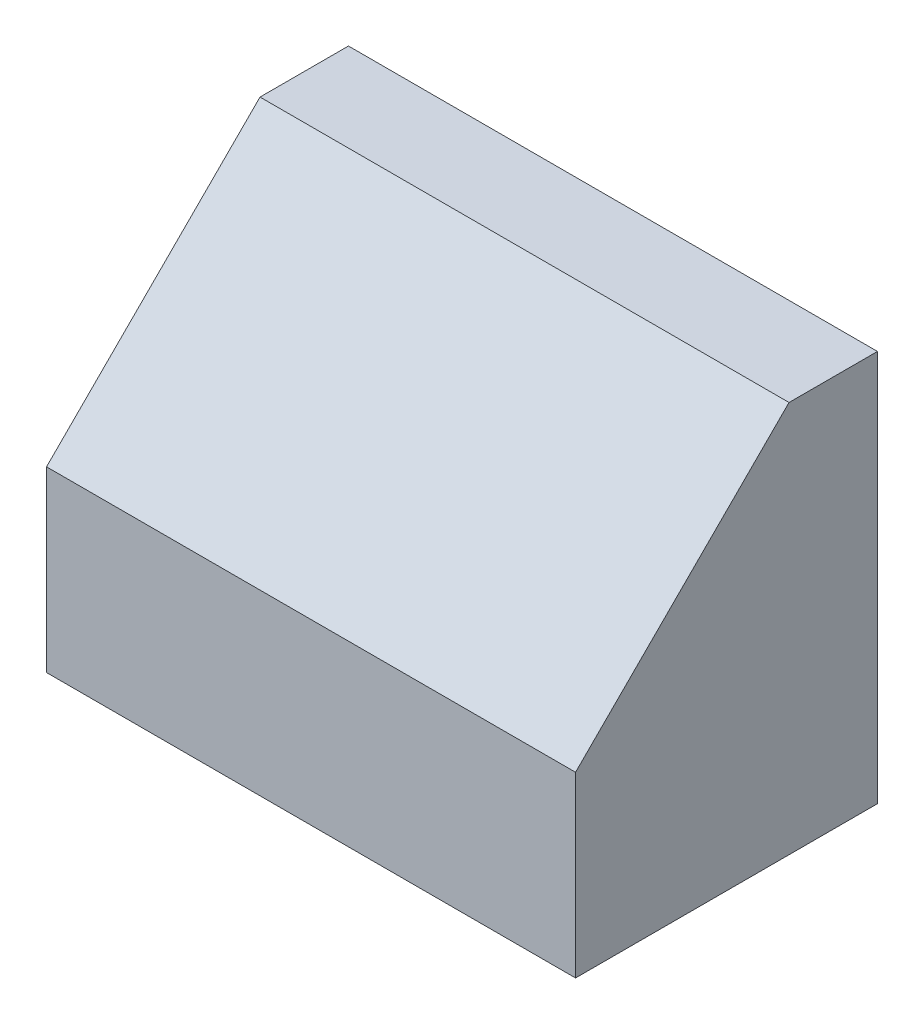
ISO-10303-21;
HEADER;
FILE_DESCRIPTION(('STEP AP214'),'2;1');
FILE_NAME('part.step','',(''),(''),'','','');
FILE_SCHEMA(('AUTOMOTIVE_DESIGN { 1 0 10303 214 1 1 1 1 }'));
ENDSEC;
DATA;
#1=APPLICATION_CONTEXT('core data for automotive mechanical design processes');
#2=APPLICATION_PROTOCOL_DEFINITION('international standard','automotive_design',2000,#1);
#3=PRODUCT_CONTEXT('',#1,'mechanical');
#4=PRODUCT('Part','Part','',(#3));
#5=PRODUCT_RELATED_PRODUCT_CATEGORY('part','',(#4));
#6=PRODUCT_DEFINITION_FORMATION('','',#4);
#7=PRODUCT_DEFINITION_CONTEXT('part definition',#1,'design');
#8=PRODUCT_DEFINITION('design','',#6,#7);
#9=PRODUCT_DEFINITION_SHAPE('','',#8);
#10=(LENGTH_UNIT() NAMED_UNIT(*) SI_UNIT(.MILLI.,.METRE.));
#11=(NAMED_UNIT(*) PLANE_ANGLE_UNIT() SI_UNIT($,.RADIAN.));
#12=(NAMED_UNIT(*) SI_UNIT($,.STERADIAN.) SOLID_ANGLE_UNIT());
#13=UNCERTAINTY_MEASURE_WITH_UNIT(LENGTH_MEASURE(1.E-05),#10,'distance_accuracy_value','');
#14=(GEOMETRIC_REPRESENTATION_CONTEXT(3) GLOBAL_UNCERTAINTY_ASSIGNED_CONTEXT((#13)) GLOBAL_UNIT_ASSIGNED_CONTEXT((#10,
#11,#12)) REPRESENTATION_CONTEXT('',''));
#15=CARTESIAN_POINT('',(0.,0.,0.));
#16=DIRECTION('',(0.,0.,1.));
#17=DIRECTION('',(1.,0.,0.));
#18=AXIS2_PLACEMENT_3D('',#15,#16,#17);
#19=CARTESIAN_POINT('',(-77.8,-57.6,88.8));
#20=DIRECTION('',(1.,0.,0.));
#21=DIRECTION('',(0.,0.,-1.));
#22=AXIS2_PLACEMENT_3D('',#19,#20,#21);
#23=PLANE('',#22);
#24=DIRECTION('',(0.,-1.,0.));
#25=VECTOR('',#24,1.);
#26=CARTESIAN_POINT('',(-77.8,-57.6,88.8));
#27=LINE('',#26,#25);
#28=CARTESIAN_POINT('',(-77.8,-5.19108216936508,88.8));
#29=VERTEX_POINT('',#28);
#30=CARTESIAN_POINT('',(-77.8,-57.6,88.8));
#31=VERTEX_POINT('',#30);
#32=EDGE_CURVE('E94',#29,#31,#27,.T.);
#33=ORIENTED_EDGE('',*,*,#32,.F.);
#34=DIRECTION('',(0.,-0.707106781186544,0.707106781186551));
#35=VECTOR('',#34,1.);
#36=CARTESIAN_POINT('',(-77.8,57.6,26.0089178306343));
#37=LINE('',#36,#35);
#38=CARTESIAN_POINT('',(-77.8,57.6,26.0089178306343));
#39=VERTEX_POINT('',#38);
#40=EDGE_CURVE('E47',#39,#29,#37,.T.);
#41=ORIENTED_EDGE('',*,*,#40,.F.);
#42=DIRECTION('',(0.,0.,-1.));
#43=VECTOR('',#42,1.);
#44=CARTESIAN_POINT('',(-77.8,57.6,88.8));
#45=LINE('',#44,#43);
#46=CARTESIAN_POINT('',(-77.8,57.6,0.));
#47=VERTEX_POINT('',#46);
#48=EDGE_CURVE('E75',#39,#47,#45,.T.);
#49=ORIENTED_EDGE('',*,*,#48,.T.);
#50=DIRECTION('',(0.,-1.,0.));
#51=VECTOR('',#50,1.);
#52=CARTESIAN_POINT('',(-77.8,-57.6,0.));
#53=LINE('',#52,#51);
#54=CARTESIAN_POINT('',(-77.8,-57.6,0.));
#55=VERTEX_POINT('',#54);
#56=EDGE_CURVE('E80',#47,#55,#53,.T.);
#57=ORIENTED_EDGE('',*,*,#56,.T.);
#58=DIRECTION('',(0.,0.,-1.));
#59=VECTOR('',#58,1.);
#60=CARTESIAN_POINT('',(-77.8,-57.6,88.8));
#61=LINE('',#60,#59);
#62=EDGE_CURVE('E11',#31,#55,#61,.T.);
#63=ORIENTED_EDGE('',*,*,#62,.F.);
#64=EDGE_LOOP('',(#33,#41,#49,#57,#63));
#65=FACE_BOUND('',#64,.T.);
#66=ADVANCED_FACE('F33',(#65),#23,.F.);
#67=CARTESIAN_POINT('',(77.8,-57.6,88.8));
#68=DIRECTION('',(0.,1.,0.));
#69=DIRECTION('',(-1.,0.,0.));
#70=AXIS2_PLACEMENT_3D('',#67,#68,#69);
#71=PLANE('',#70);
#72=DIRECTION('',(1.,0.,0.));
#73=VECTOR('',#72,1.);
#74=CARTESIAN_POINT('',(77.8,-57.6,0.));
#75=LINE('',#74,#73);
#76=CARTESIAN_POINT('',(77.8,-57.6,0.));
#77=VERTEX_POINT('',#76);
#78=EDGE_CURVE('E98',#55,#77,#75,.T.);
#79=ORIENTED_EDGE('',*,*,#78,.T.);
#80=DIRECTION('',(0.,0.,-1.));
#81=VECTOR('',#80,1.);
#82=CARTESIAN_POINT('',(77.8,-57.6,88.8));
#83=LINE('',#82,#81);
#84=CARTESIAN_POINT('',(77.8,-57.6,88.8));
#85=VERTEX_POINT('',#84);
#86=EDGE_CURVE('E40',#85,#77,#83,.T.);
#87=ORIENTED_EDGE('',*,*,#86,.F.);
#88=DIRECTION('',(1.,0.,0.));
#89=VECTOR('',#88,1.);
#90=CARTESIAN_POINT('',(77.8,-57.6,88.8));
#91=LINE('',#90,#89);
#92=EDGE_CURVE('E56',#31,#85,#91,.T.);
#93=ORIENTED_EDGE('',*,*,#92,.F.);
#94=ORIENTED_EDGE('',*,*,#62,.T.);
#95=EDGE_LOOP('',(#79,#87,#93,#94));
#96=FACE_BOUND('',#95,.T.);
#97=ADVANCED_FACE('F114',(#96),#71,.F.);
#98=CARTESIAN_POINT('',(77.8,-57.6,88.8));
#99=DIRECTION('',(-1.,0.,0.));
#100=DIRECTION('',(0.,0.,1.));
#101=AXIS2_PLACEMENT_3D('',#98,#99,#100);
#102=PLANE('',#101);
#103=DIRECTION('',(0.,0.,-1.));
#104=VECTOR('',#103,1.);
#105=CARTESIAN_POINT('',(77.8,57.6,88.8));
#106=LINE('',#105,#104);
#107=CARTESIAN_POINT('',(77.8,57.6,26.0089178306343));
#108=VERTEX_POINT('',#107);
#109=CARTESIAN_POINT('',(77.8,57.6,0.));
#110=VERTEX_POINT('',#109);
#111=EDGE_CURVE('E84',#108,#110,#106,.T.);
#112=ORIENTED_EDGE('',*,*,#111,.F.);
#113=DIRECTION('',(0.,-0.707106781186544,0.707106781186551));
#114=VECTOR('',#113,1.);
#115=CARTESIAN_POINT('',(77.8,57.6,26.0089178306343));
#116=LINE('',#115,#114);
#117=CARTESIAN_POINT('',(77.8,-5.19108216936508,88.8));
#118=VERTEX_POINT('',#117);
#119=EDGE_CURVE('E117',#108,#118,#116,.T.);
#120=ORIENTED_EDGE('',*,*,#119,.T.);
#121=DIRECTION('',(0.,1.,0.));
#122=VECTOR('',#121,1.);
#123=CARTESIAN_POINT('',(77.8,-57.6,88.8));
#124=LINE('',#123,#122);
#125=EDGE_CURVE('E85',#85,#118,#124,.T.);
#126=ORIENTED_EDGE('',*,*,#125,.F.);
#127=ORIENTED_EDGE('',*,*,#86,.T.);
#128=DIRECTION('',(0.,1.,0.));
#129=VECTOR('',#128,1.);
#130=CARTESIAN_POINT('',(77.8,-57.6,0.));
#131=LINE('',#130,#129);
#132=EDGE_CURVE('E95',#77,#110,#131,.T.);
#133=ORIENTED_EDGE('',*,*,#132,.T.);
#134=EDGE_LOOP('',(#112,#120,#126,#127,#133));
#135=FACE_BOUND('',#134,.T.);
#136=ADVANCED_FACE('F111',(#135),#102,.F.);
#137=CARTESIAN_POINT('',(77.8,57.6,88.8));
#138=DIRECTION('',(0.,-1.,0.));
#139=DIRECTION('',(0.,0.,-1.));
#140=AXIS2_PLACEMENT_3D('',#137,#138,#139);
#141=PLANE('',#140);
#142=ORIENTED_EDGE('',*,*,#48,.F.);
#143=DIRECTION('',(-1.,0.,0.));
#144=VECTOR('',#143,1.);
#145=CARTESIAN_POINT('',(77.8,57.6,26.0089178306343));
#146=LINE('',#145,#144);
#147=EDGE_CURVE('E102',#108,#39,#146,.T.);
#148=ORIENTED_EDGE('',*,*,#147,.F.);
#149=ORIENTED_EDGE('',*,*,#111,.T.);
#150=DIRECTION('',(-1.,0.,0.));
#151=VECTOR('',#150,1.);
#152=CARTESIAN_POINT('',(77.8,57.6,0.));
#153=LINE('',#152,#151);
#154=EDGE_CURVE('E88',#110,#47,#153,.T.);
#155=ORIENTED_EDGE('',*,*,#154,.T.);
#156=EDGE_LOOP('',(#142,#148,#149,#155));
#157=FACE_BOUND('',#156,.T.);
#158=ADVANCED_FACE('F89',(#157),#141,.F.);
#159=CARTESIAN_POINT('',(0.,0.,88.8));
#160=DIRECTION('',(0.,0.,1.));
#161=DIRECTION('',(1.,0.,0.));
#162=AXIS2_PLACEMENT_3D('',#159,#160,#161);
#163=PLANE('',#162);
#164=DIRECTION('',(-1.,0.,0.));
#165=VECTOR('',#164,1.);
#166=CARTESIAN_POINT('',(77.8,-5.19108216936508,88.8));
#167=LINE('',#166,#165);
#168=EDGE_CURVE('E99',#118,#29,#167,.T.);
#169=ORIENTED_EDGE('',*,*,#168,.T.);
#170=ORIENTED_EDGE('',*,*,#32,.T.);
#171=ORIENTED_EDGE('',*,*,#92,.T.);
#172=ORIENTED_EDGE('',*,*,#125,.T.);
#173=EDGE_LOOP('',(#169,#170,#171,#172));
#174=FACE_BOUND('',#173,.T.);
#175=ADVANCED_FACE('F123',(#174),#163,.T.);
#176=CARTESIAN_POINT('',(0.,0.,0.));
#177=DIRECTION('',(0.,0.,1.));
#178=DIRECTION('',(1.,0.,0.));
#179=AXIS2_PLACEMENT_3D('',#176,#177,#178);
#180=PLANE('',#179);
#181=ORIENTED_EDGE('',*,*,#56,.F.);
#182=ORIENTED_EDGE('',*,*,#154,.F.);
#183=ORIENTED_EDGE('',*,*,#132,.F.);
#184=ORIENTED_EDGE('',*,*,#78,.F.);
#185=EDGE_LOOP('',(#181,#182,#183,#184));
#186=FACE_BOUND('',#185,.T.);
#187=ADVANCED_FACE('F97',(#186),#180,.F.);
#188=CARTESIAN_POINT('',(77.8,57.6,26.0089178306343));
#189=DIRECTION('',(0.,-0.707106781186551,-0.707106781186544));
#190=DIRECTION('',(0.,0.707106781186544,-0.707106781186551));
#191=AXIS2_PLACEMENT_3D('',#188,#189,#190);
#192=PLANE('',#191);
#193=ORIENTED_EDGE('',*,*,#40,.T.);
#194=ORIENTED_EDGE('',*,*,#168,.F.);
#195=ORIENTED_EDGE('',*,*,#119,.F.);
#196=ORIENTED_EDGE('',*,*,#147,.T.);
#197=EDGE_LOOP('',(#193,#194,#195,#196));
#198=FACE_BOUND('',#197,.T.);
#199=ADVANCED_FACE('F124',(#198),#192,.F.);
#200=CLOSED_SHELL('',(#66,#97,#136,#158,#175,#187,#199));
#201=MANIFOLD_SOLID_BREP('B2',#200);
#202=ADVANCED_BREP_SHAPE_REPRESENTATION('',(#18,#201),#14);
#203=SHAPE_DEFINITION_REPRESENTATION(#9,#202);
ENDSEC;
END-ISO-10303-21;
